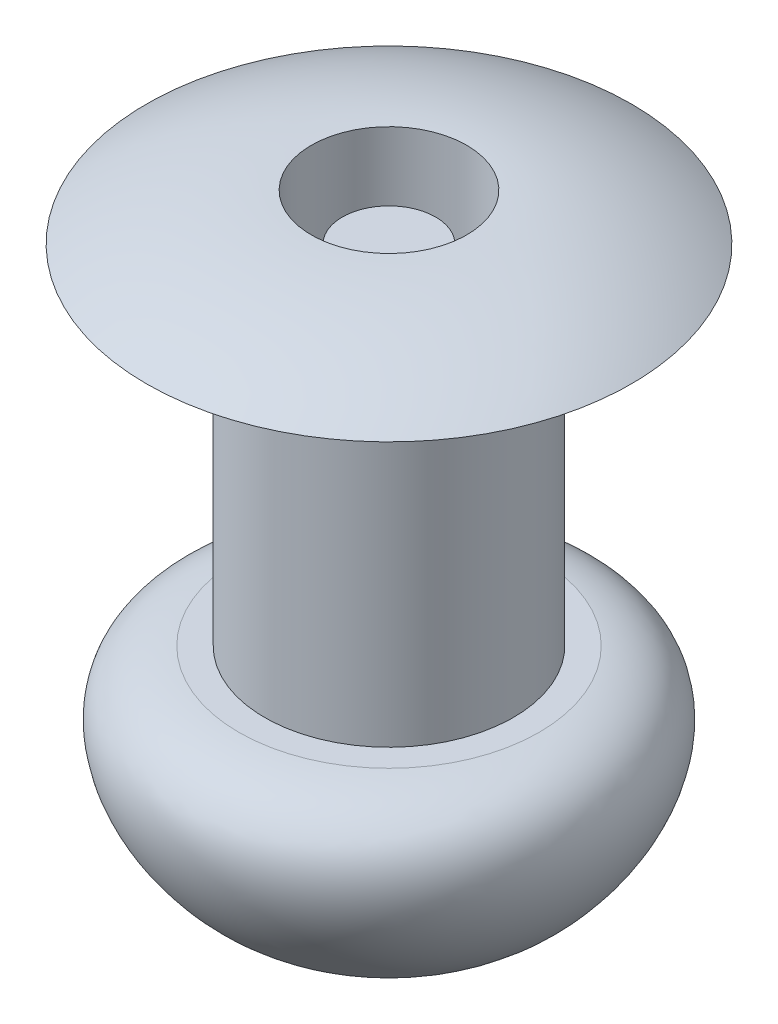
ISO-10303-21;
HEADER;
FILE_DESCRIPTION(('STEP AP214'),'2;1');
FILE_NAME('part.step','',(''),(''),'','','');
FILE_SCHEMA(('AUTOMOTIVE_DESIGN { 1 0 10303 214 1 1 1 1 }'));
ENDSEC;
DATA;
#1=APPLICATION_CONTEXT('core data for automotive mechanical design processes');
#2=APPLICATION_PROTOCOL_DEFINITION('international standard','automotive_design',2000,#1);
#3=PRODUCT_CONTEXT('',#1,'mechanical');
#4=PRODUCT('Part','Part','',(#3));
#5=PRODUCT_RELATED_PRODUCT_CATEGORY('part','',(#4));
#6=PRODUCT_DEFINITION_FORMATION('','',#4);
#7=PRODUCT_DEFINITION_CONTEXT('part definition',#1,'design');
#8=PRODUCT_DEFINITION('design','',#6,#7);
#9=PRODUCT_DEFINITION_SHAPE('','',#8);
#10=(LENGTH_UNIT() NAMED_UNIT(*) SI_UNIT(.MILLI.,.METRE.));
#11=(NAMED_UNIT(*) PLANE_ANGLE_UNIT() SI_UNIT($,.RADIAN.));
#12=(NAMED_UNIT(*) SI_UNIT($,.STERADIAN.) SOLID_ANGLE_UNIT());
#13=UNCERTAINTY_MEASURE_WITH_UNIT(LENGTH_MEASURE(1.E-05),#10,'distance_accuracy_value','');
#14=(GEOMETRIC_REPRESENTATION_CONTEXT(3) GLOBAL_UNCERTAINTY_ASSIGNED_CONTEXT((#13)) GLOBAL_UNIT_ASSIGNED_CONTEXT((#10,
#11,#12)) REPRESENTATION_CONTEXT('',''));
#15=CARTESIAN_POINT('',(0.,0.,0.));
#16=DIRECTION('',(0.,0.,1.));
#17=DIRECTION('',(1.,0.,0.));
#18=AXIS2_PLACEMENT_3D('',#15,#16,#17);
#19=CARTESIAN_POINT('',(0.,0.,0.));
#20=DIRECTION('',(0.,-1.,0.));
#21=DIRECTION('',(0.,0.,-1.));
#22=AXIS2_PLACEMENT_3D('',#19,#20,#21);
#23=PLANE('',#22);
#24=CARTESIAN_POINT('',(0.,0.,0.));
#25=DIRECTION('',(0.,-1.,0.));
#26=DIRECTION('',(0.,0.,-1.));
#27=AXIS2_PLACEMENT_3D('',#24,#25,#26);
#28=CIRCLE('',#27,0.75);
#29=CARTESIAN_POINT('',(0.,0.,-0.75));
#30=VERTEX_POINT('',#29);
#31=EDGE_CURVE('E11',#30,#30,#28,.T.);
#32=ORIENTED_EDGE('',*,*,#31,.F.);
#33=EDGE_LOOP('',(#32));
#34=FACE_BOUND('',#33,.T.);
#35=ADVANCED_FACE('F32',(#34),#23,.F.);
#36=CARTESIAN_POINT('',(0.,0.,0.));
#37=DIRECTION('',(0.,-1.,0.));
#38=DIRECTION('',(0.,0.,-1.));
#39=AXIS2_PLACEMENT_3D('',#36,#37,#38);
#40=CYLINDRICAL_SURFACE('',#39,0.75);
#41=CARTESIAN_POINT('',(0.,-5.79843593019889,0.));
#42=DIRECTION('',(0.,-1.,0.));
#43=DIRECTION('',(0.,0.,-1.));
#44=AXIS2_PLACEMENT_3D('',#41,#42,#43);
#45=CIRCLE('',#44,0.749999999999999);
#46=CARTESIAN_POINT('',(0.,-5.79843593019889,-0.749999999999999));
#47=VERTEX_POINT('',#46);
#48=EDGE_CURVE('E38',#47,#47,#45,.T.);
#49=ORIENTED_EDGE('',*,*,#48,.F.);
#50=EDGE_LOOP('',(#49));
#51=FACE_BOUND('',#50,.T.);
#52=ORIENTED_EDGE('',*,*,#31,.T.);
#53=EDGE_LOOP('',(#52));
#54=FACE_BOUND('',#53,.T.);
#55=ADVANCED_FACE('F77',(#51,#54),#40,.T.);
#56=CARTESIAN_POINT('',(0.,-5.79843593019889,0.749999999999999));
#57=DIRECTION('',(0.,-1.,0.));
#58=DIRECTION('',(0.,0.,-1.));
#59=AXIS2_PLACEMENT_3D('',#56,#57,#58);
#60=PLANE('',#59);
#61=CARTESIAN_POINT('',(0.,-5.79843593019889,0.));
#62=DIRECTION('',(0.,-1.,0.));
#63=DIRECTION('',(0.,0.,-1.));
#64=AXIS2_PLACEMENT_3D('',#61,#62,#63);
#65=CIRCLE('',#64,1.25);
#66=CARTESIAN_POINT('',(0.,-5.79843593019889,-1.25));
#67=VERTEX_POINT('',#66);
#68=EDGE_CURVE('E70',#67,#67,#65,.T.);
#69=ORIENTED_EDGE('',*,*,#68,.F.);
#70=EDGE_LOOP('',(#69));
#71=FACE_BOUND('',#70,.T.);
#72=ORIENTED_EDGE('',*,*,#48,.T.);
#73=EDGE_LOOP('',(#72));
#74=FACE_BOUND('',#73,.T.);
#75=ADVANCED_FACE('F75',(#71,#74),#60,.F.);
#76=CARTESIAN_POINT('',(0.,0.,0.));
#77=DIRECTION('',(0.,-1.,0.));
#78=DIRECTION('',(0.,0.,-1.));
#79=AXIS2_PLACEMENT_3D('',#76,#77,#78);
#80=CYLINDRICAL_SURFACE('',#79,1.25);
#81=CARTESIAN_POINT('',(0.,0.75,0.));
#82=DIRECTION('',(0.,-1.,0.));
#83=DIRECTION('',(0.,0.,-1.));
#84=AXIS2_PLACEMENT_3D('',#81,#82,#83);
#85=CIRCLE('',#84,1.25);
#86=CARTESIAN_POINT('',(0.,0.75,-1.25));
#87=VERTEX_POINT('',#86);
#88=EDGE_CURVE('E67',#87,#87,#85,.T.);
#89=ORIENTED_EDGE('',*,*,#88,.F.);
#90=EDGE_LOOP('',(#89));
#91=FACE_BOUND('',#90,.T.);
#92=ORIENTED_EDGE('',*,*,#68,.T.);
#93=EDGE_LOOP('',(#92));
#94=FACE_BOUND('',#93,.T.);
#95=ADVANCED_FACE('F95',(#91,#94),#80,.F.);
#96=CARTESIAN_POINT('',(0.,-4.30666666666667,0.));
#97=DIRECTION('',(0.,-1.,0.));
#98=DIRECTION('',(0.,0.,-1.));
#99=AXIS2_PLACEMENT_3D('',#96,#97,#98);
#100=DEGENERATE_TOROIDAL_SURFACE('',#99,1.25,5.05666666666667,.T.);
#101=CARTESIAN_POINT('',(0.,0.,0.));
#102=DIRECTION('',(0.,-1.,0.));
#103=DIRECTION('',(0.,0.,-1.));
#104=AXIS2_PLACEMENT_3D('',#101,#102,#103);
#105=CIRCLE('',#104,3.9);
#106=CARTESIAN_POINT('',(0.,0.,-3.9));
#107=VERTEX_POINT('',#106);
#108=EDGE_CURVE('E64',#107,#107,#105,.T.);
#109=ORIENTED_EDGE('',*,*,#108,.F.);
#110=EDGE_LOOP('',(#109));
#111=FACE_BOUND('',#110,.T.);
#112=ORIENTED_EDGE('',*,*,#88,.T.);
#113=EDGE_LOOP('',(#112));
#114=FACE_BOUND('',#113,.T.);
#115=ADVANCED_FACE('F103',(#111,#114),#100,.T.);
#116=CARTESIAN_POINT('',(0.,0.,3.9));
#117=DIRECTION('',(0.,1.,0.));
#118=DIRECTION('',(0.,0.,1.));
#119=AXIS2_PLACEMENT_3D('',#116,#117,#118);
#120=PLANE('',#119);
#121=CARTESIAN_POINT('',(0.,0.,0.));
#122=DIRECTION('',(0.,-1.,0.));
#123=DIRECTION('',(0.,0.,-1.));
#124=AXIS2_PLACEMENT_3D('',#121,#122,#123);
#125=CIRCLE('',#124,2.);
#126=CARTESIAN_POINT('',(0.,0.,-2.));
#127=VERTEX_POINT('',#126);
#128=EDGE_CURVE('E61',#127,#127,#125,.T.);
#129=ORIENTED_EDGE('',*,*,#128,.F.);
#130=EDGE_LOOP('',(#129));
#131=FACE_BOUND('',#130,.T.);
#132=ORIENTED_EDGE('',*,*,#108,.T.);
#133=EDGE_LOOP('',(#132));
#134=FACE_BOUND('',#133,.T.);
#135=ADVANCED_FACE('F111',(#131,#134),#120,.F.);
#136=CARTESIAN_POINT('',(0.,0.,0.));
#137=DIRECTION('',(0.,-1.,0.));
#138=DIRECTION('',(0.,0.,-1.));
#139=AXIS2_PLACEMENT_3D('',#136,#137,#138);
#140=CYLINDRICAL_SURFACE('',#139,2.);
#141=CARTESIAN_POINT('',(0.,-5.59769740720891,0.));
#142=DIRECTION('',(0.,-1.,0.));
#143=DIRECTION('',(0.,0.,-1.));
#144=AXIS2_PLACEMENT_3D('',#141,#142,#143);
#145=CIRCLE('',#144,2.);
#146=CARTESIAN_POINT('',(0.,-5.59769740720891,-2.));
#147=VERTEX_POINT('',#146);
#148=EDGE_CURVE('E53',#147,#147,#145,.T.);
#149=ORIENTED_EDGE('',*,*,#148,.F.);
#150=EDGE_LOOP('',(#149));
#151=FACE_BOUND('',#150,.T.);
#152=ORIENTED_EDGE('',*,*,#128,.T.);
#153=EDGE_LOOP('',(#152));
#154=FACE_BOUND('',#153,.T.);
#155=ADVANCED_FACE('F119',(#151,#154),#140,.T.);
#156=CARTESIAN_POINT('',(0.,-5.59769740720891,2.));
#157=DIRECTION('',(0.,-1.,0.));
#158=DIRECTION('',(0.,0.,-1.));
#159=AXIS2_PLACEMENT_3D('',#156,#157,#158);
#160=PLANE('',#159);
#161=CARTESIAN_POINT('',(0.,-5.59769740720891,0.));
#162=DIRECTION('',(0.,-1.,0.));
#163=DIRECTION('',(0.,0.,-1.));
#164=AXIS2_PLACEMENT_3D('',#161,#162,#163);
#165=CIRCLE('',#164,2.4138917546613);
#166=CARTESIAN_POINT('',(0.,-5.59769740720891,-2.4138917546613));
#167=VERTEX_POINT('',#166);
#168=EDGE_CURVE('E50',#167,#167,#165,.T.);
#169=ORIENTED_EDGE('',*,*,#168,.F.);
#170=EDGE_LOOP('',(#169));
#171=FACE_BOUND('',#170,.T.);
#172=ORIENTED_EDGE('',*,*,#148,.T.);
#173=EDGE_LOOP('',(#172));
#174=FACE_BOUND('',#173,.T.);
#175=ADVANCED_FACE('F127',(#171,#174),#160,.F.);
#176=CARTESIAN_POINT('',(0.,-5.59769740720891,2.4138917546613));
#177=CARTESIAN_POINT('',(0.,-5.76735472893749,3.86750311174021));
#178=CARTESIAN_POINT('',(0.,-7.89971103364728,3.52887764908681));
#179=CARTESIAN_POINT('',(0.,-9.47122977604134,1.08396164238539));
#180=CARTESIAN_POINT('',(0.,-7.47264670482557,0.271752617549607));
#181=CARTESIAN_POINT('',(0.,-7.17662660078956,0.956030426512504));
#182=B_SPLINE_CURVE_WITH_KNOTS('',3,(#176,#177,#178,#179,#180,#181),.UNSPECIFIED.,.F.,.F.,(4,1,
1,4),(0.,0.464993081764921,0.721927552661067,1.),.UNSPECIFIED.);
#183=CARTESIAN_POINT('',(0.,0.,0.));
#184=DIRECTION('',(0.,-1.,0.));
#185=AXIS1_PLACEMENT('',#183,#184);
#186=SURFACE_OF_REVOLUTION('',#182,#185);
#187=CARTESIAN_POINT('',(0.,-7.17662660078956,0.));
#188=DIRECTION('',(0.,-1.,0.));
#189=DIRECTION('',(0.,0.,-1.));
#190=AXIS2_PLACEMENT_3D('',#187,#188,#189);
#191=CIRCLE('',#190,0.956030426512504);
#192=CARTESIAN_POINT('',(0.,-7.17662660078956,-0.956030426512504));
#193=VERTEX_POINT('',#192);
#194=EDGE_CURVE('E48',#193,#193,#191,.T.);
#195=ORIENTED_EDGE('',*,*,#194,.F.);
#196=EDGE_LOOP('',(#195));
#197=FACE_BOUND('',#196,.T.);
#198=ORIENTED_EDGE('',*,*,#168,.T.);
#199=EDGE_LOOP('',(#198));
#200=FACE_BOUND('',#199,.T.);
#201=ADVANCED_FACE('F44',(#197,#200),#186,.T.);
#202=CARTESIAN_POINT('',(0.,-6.54843593019888,0.));
#203=DIRECTION('',(1.,0.,0.));
#204=DIRECTION('',(0.,0.,1.));
#205=AXIS2_PLACEMENT_3D('',#202,#203,#204);
#206=ELLIPSE('',#205,1.75,0.75);
#207=TRIMMED_CURVE('',#206,(PARAMETER_VALUE(-1.5707963267949)),
(PARAMETER_VALUE(1.5707963267949)),.T.,.PARAMETER.);
#208=CARTESIAN_POINT('',(0.,0.,0.));
#209=DIRECTION('',(0.,-1.,0.));
#210=AXIS1_PLACEMENT('',#208,#209);
#211=SURFACE_OF_REVOLUTION('',#207,#210);
#212=CARTESIAN_POINT('',(0.,-7.29843593019888,0.));
#213=VERTEX_POINT('',#212);
#214=VERTEX_LOOP('',#213);
#215=FACE_BOUND('',#214,.T.);
#216=ORIENTED_EDGE('',*,*,#194,.T.);
#217=EDGE_LOOP('',(#216));
#218=FACE_BOUND('',#217,.T.);
#219=ADVANCED_FACE('F41',(#215,#218),#211,.T.);
#220=CLOSED_SHELL('',(#35,#55,#75,#95,#115,#135,#155,#175,#201,#219));
#221=MANIFOLD_SOLID_BREP('B2',#220);
#222=ADVANCED_BREP_SHAPE_REPRESENTATION('',(#18,#221),#14);
#223=SHAPE_DEFINITION_REPRESENTATION(#9,#222);
ENDSEC;
END-ISO-10303-21;
